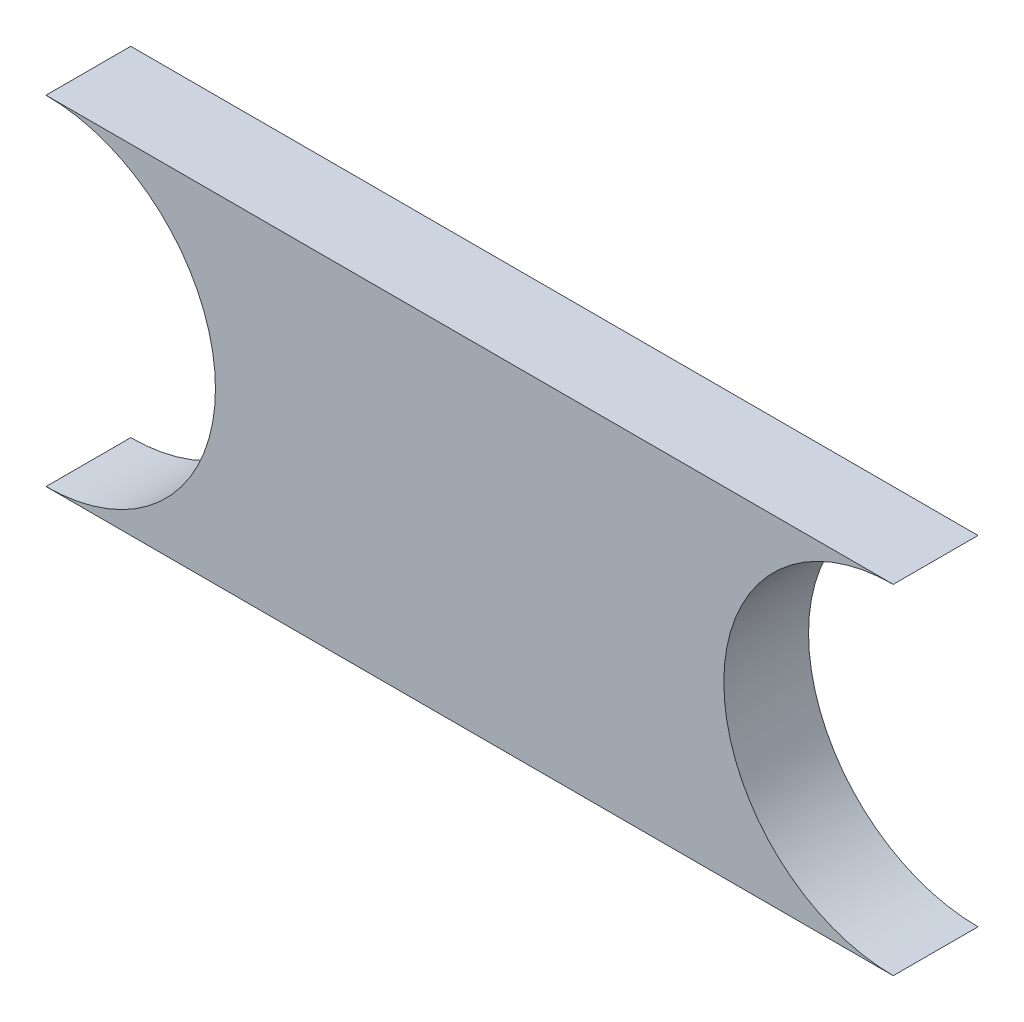
ISO-10303-21;
HEADER;
FILE_DESCRIPTION(('STEP AP214'),'2;1');
FILE_NAME('part.step','',(''),(''),'','','');
FILE_SCHEMA(('AUTOMOTIVE_DESIGN { 1 0 10303 214 1 1 1 1 }'));
ENDSEC;
DATA;
#1=APPLICATION_CONTEXT('core data for automotive mechanical design processes');
#2=APPLICATION_PROTOCOL_DEFINITION('international standard','automotive_design',2000,#1);
#3=PRODUCT_CONTEXT('',#1,'mechanical');
#4=PRODUCT('Part','Part','',(#3));
#5=PRODUCT_RELATED_PRODUCT_CATEGORY('part','',(#4));
#6=PRODUCT_DEFINITION_FORMATION('','',#4);
#7=PRODUCT_DEFINITION_CONTEXT('part definition',#1,'design');
#8=PRODUCT_DEFINITION('design','',#6,#7);
#9=PRODUCT_DEFINITION_SHAPE('','',#8);
#10=(LENGTH_UNIT() NAMED_UNIT(*) SI_UNIT(.MILLI.,.METRE.));
#11=(NAMED_UNIT(*) PLANE_ANGLE_UNIT() SI_UNIT($,.RADIAN.));
#12=(NAMED_UNIT(*) SI_UNIT($,.STERADIAN.) SOLID_ANGLE_UNIT());
#13=UNCERTAINTY_MEASURE_WITH_UNIT(LENGTH_MEASURE(1.E-05),#10,'distance_accuracy_value','');
#14=(GEOMETRIC_REPRESENTATION_CONTEXT(3) GLOBAL_UNCERTAINTY_ASSIGNED_CONTEXT((#13)) GLOBAL_UNIT_ASSIGNED_CONTEXT((#10,
#11,#12)) REPRESENTATION_CONTEXT('',''));
#15=CARTESIAN_POINT('',(0.,0.,0.));
#16=DIRECTION('',(0.,0.,1.));
#17=DIRECTION('',(1.,0.,0.));
#18=AXIS2_PLACEMENT_3D('',#15,#16,#17);
#19=CARTESIAN_POINT('',(-13.7835526681264,0.,12.7));
#20=DIRECTION('',(0.,0.,-1.));
#21=DIRECTION('',(-1.,0.,0.));
#22=AXIS2_PLACEMENT_3D('',#19,#20,#21);
#23=CYLINDRICAL_SURFACE('',#22,25.4);
#24=CARTESIAN_POINT('',(-13.7835526681264,0.,0.));
#25=DIRECTION('',(0.,0.,-1.));
#26=DIRECTION('',(-1.,0.,0.));
#27=AXIS2_PLACEMENT_3D('',#24,#25,#26);
#28=CIRCLE('',#27,25.4);
#29=CARTESIAN_POINT('',(-13.7835526681264,25.4,0.));
#30=VERTEX_POINT('',#29);
#31=CARTESIAN_POINT('',(-13.7835526681264,-25.4,0.));
#32=VERTEX_POINT('',#31);
#33=EDGE_CURVE('E107',#30,#32,#28,.T.);
#34=ORIENTED_EDGE('',*,*,#33,.T.);
#35=DIRECTION('',(0.,0.,-1.));
#36=VECTOR('',#35,1.);
#37=CARTESIAN_POINT('',(-13.7835526681264,-25.4,12.7));
#38=LINE('',#37,#36);
#39=CARTESIAN_POINT('',(-13.7835526681264,-25.4,12.7));
#40=VERTEX_POINT('',#39);
#41=EDGE_CURVE('E11',#40,#32,#38,.T.);
#42=ORIENTED_EDGE('',*,*,#41,.F.);
#43=CARTESIAN_POINT('',(-13.7835526681264,0.,12.7));
#44=DIRECTION('',(0.,0.,-1.));
#45=DIRECTION('',(-1.,0.,0.));
#46=AXIS2_PLACEMENT_3D('',#43,#44,#45);
#47=CIRCLE('',#46,25.4);
#48=CARTESIAN_POINT('',(-13.7835526681264,25.4,12.7));
#49=VERTEX_POINT('',#48);
#50=EDGE_CURVE('E91',#49,#40,#47,.T.);
#51=ORIENTED_EDGE('',*,*,#50,.F.);
#52=DIRECTION('',(0.,0.,-1.));
#53=VECTOR('',#52,1.);
#54=CARTESIAN_POINT('',(-13.7835526681264,25.4,12.7));
#55=LINE('',#54,#53);
#56=EDGE_CURVE('E103',#49,#30,#55,.T.);
#57=ORIENTED_EDGE('',*,*,#56,.T.);
#58=EDGE_LOOP('',(#34,#42,#51,#57));
#59=FACE_BOUND('',#58,.T.);
#60=ADVANCED_FACE('F39',(#59),#23,.F.);
#61=CARTESIAN_POINT('',(113.216447331874,-25.4,12.7));
#62=DIRECTION('',(0.,1.,0.));
#63=DIRECTION('',(0.,0.,1.));
#64=AXIS2_PLACEMENT_3D('',#61,#62,#63);
#65=PLANE('',#64);
#66=DIRECTION('',(1.,0.,0.));
#67=VECTOR('',#66,1.);
#68=CARTESIAN_POINT('',(113.216447331874,-25.4,0.));
#69=LINE('',#68,#67);
#70=CARTESIAN_POINT('',(113.216447331874,-25.4,0.));
#71=VERTEX_POINT('',#70);
#72=EDGE_CURVE('E96',#32,#71,#69,.T.);
#73=ORIENTED_EDGE('',*,*,#72,.T.);
#74=DIRECTION('',(0.,0.,-1.));
#75=VECTOR('',#74,1.);
#76=CARTESIAN_POINT('',(113.216447331874,-25.4,12.7));
#77=LINE('',#76,#75);
#78=CARTESIAN_POINT('',(113.216447331874,-25.4,12.7));
#79=VERTEX_POINT('',#78);
#80=EDGE_CURVE('E48',#79,#71,#77,.T.);
#81=ORIENTED_EDGE('',*,*,#80,.F.);
#82=DIRECTION('',(1.,0.,0.));
#83=VECTOR('',#82,1.);
#84=CARTESIAN_POINT('',(113.216447331874,-25.4,12.7));
#85=LINE('',#84,#83);
#86=EDGE_CURVE('E86',#40,#79,#85,.T.);
#87=ORIENTED_EDGE('',*,*,#86,.F.);
#88=ORIENTED_EDGE('',*,*,#41,.T.);
#89=EDGE_LOOP('',(#73,#81,#87,#88));
#90=FACE_BOUND('',#89,.T.);
#91=ADVANCED_FACE('F95',(#90),#65,.F.);
#92=CARTESIAN_POINT('',(113.216447331874,0.,12.7));
#93=DIRECTION('',(0.,0.,-1.));
#94=DIRECTION('',(-1.,0.,0.));
#95=AXIS2_PLACEMENT_3D('',#92,#93,#94);
#96=CYLINDRICAL_SURFACE('',#95,25.4);
#97=CARTESIAN_POINT('',(113.216447331874,0.,0.));
#98=DIRECTION('',(0.,0.,-1.));
#99=DIRECTION('',(1.,0.,0.));
#100=AXIS2_PLACEMENT_3D('',#97,#98,#99);
#101=CIRCLE('',#100,25.4);
#102=CARTESIAN_POINT('',(113.216447331874,25.4,0.));
#103=VERTEX_POINT('',#102);
#104=EDGE_CURVE('E73',#71,#103,#101,.T.);
#105=ORIENTED_EDGE('',*,*,#104,.T.);
#106=DIRECTION('',(0.,0.,-1.));
#107=VECTOR('',#106,1.);
#108=CARTESIAN_POINT('',(113.216447331874,25.4,12.7));
#109=LINE('',#108,#107);
#110=CARTESIAN_POINT('',(113.216447331874,25.4,12.7));
#111=VERTEX_POINT('',#110);
#112=EDGE_CURVE('E98',#111,#103,#109,.T.);
#113=ORIENTED_EDGE('',*,*,#112,.F.);
#114=CARTESIAN_POINT('',(113.216447331874,0.,12.7));
#115=DIRECTION('',(0.,0.,-1.));
#116=DIRECTION('',(1.,0.,0.));
#117=AXIS2_PLACEMENT_3D('',#114,#115,#116);
#118=CIRCLE('',#117,25.4);
#119=EDGE_CURVE('E89',#79,#111,#118,.T.);
#120=ORIENTED_EDGE('',*,*,#119,.F.);
#121=ORIENTED_EDGE('',*,*,#80,.T.);
#122=EDGE_LOOP('',(#105,#113,#120,#121));
#123=FACE_BOUND('',#122,.T.);
#124=ADVANCED_FACE('F99',(#123),#96,.F.);
#125=CARTESIAN_POINT('',(-13.7835526681264,25.4,12.7));
#126=DIRECTION('',(0.,-1.,0.));
#127=DIRECTION('',(0.,0.,-1.));
#128=AXIS2_PLACEMENT_3D('',#125,#126,#127);
#129=PLANE('',#128);
#130=DIRECTION('',(-1.,0.,0.));
#131=VECTOR('',#130,1.);
#132=CARTESIAN_POINT('',(-13.7835526681264,25.4,0.));
#133=LINE('',#132,#131);
#134=EDGE_CURVE('E79',#103,#30,#133,.T.);
#135=ORIENTED_EDGE('',*,*,#134,.T.);
#136=ORIENTED_EDGE('',*,*,#56,.F.);
#137=DIRECTION('',(-1.,0.,0.));
#138=VECTOR('',#137,1.);
#139=CARTESIAN_POINT('',(-13.7835526681264,25.4,12.7));
#140=LINE('',#139,#138);
#141=EDGE_CURVE('E56',#111,#49,#140,.T.);
#142=ORIENTED_EDGE('',*,*,#141,.F.);
#143=ORIENTED_EDGE('',*,*,#112,.T.);
#144=EDGE_LOOP('',(#135,#136,#142,#143));
#145=FACE_BOUND('',#144,.T.);
#146=ADVANCED_FACE('F120',(#145),#129,.F.);
#147=CARTESIAN_POINT('',(-13.7835526681264,0.,12.7));
#148=DIRECTION('',(0.,0.,-1.));
#149=DIRECTION('',(-1.,0.,0.));
#150=AXIS2_PLACEMENT_3D('',#147,#148,#149);
#151=PLANE('',#150);
#152=ORIENTED_EDGE('',*,*,#50,.T.);
#153=ORIENTED_EDGE('',*,*,#86,.T.);
#154=ORIENTED_EDGE('',*,*,#119,.T.);
#155=ORIENTED_EDGE('',*,*,#141,.T.);
#156=EDGE_LOOP('',(#152,#153,#154,#155));
#157=FACE_BOUND('',#156,.T.);
#158=ADVANCED_FACE('F87',(#157),#151,.F.);
#159=CARTESIAN_POINT('',(-13.7835526681264,0.,0.));
#160=DIRECTION('',(0.,0.,-1.));
#161=DIRECTION('',(-1.,0.,0.));
#162=AXIS2_PLACEMENT_3D('',#159,#160,#161);
#163=PLANE('',#162);
#164=ORIENTED_EDGE('',*,*,#33,.F.);
#165=ORIENTED_EDGE('',*,*,#134,.F.);
#166=ORIENTED_EDGE('',*,*,#104,.F.);
#167=ORIENTED_EDGE('',*,*,#72,.F.);
#168=EDGE_LOOP('',(#164,#165,#166,#167));
#169=FACE_BOUND('',#168,.T.);
#170=ADVANCED_FACE('F123',(#169),#163,.T.);
#171=CLOSED_SHELL('',(#60,#91,#124,#146,#158,#170));
#172=MANIFOLD_SOLID_BREP('B2',#171);
#173=ADVANCED_BREP_SHAPE_REPRESENTATION('',(#18,#172),#14);
#174=SHAPE_DEFINITION_REPRESENTATION(#9,#173);
ENDSEC;
END-ISO-10303-21;
